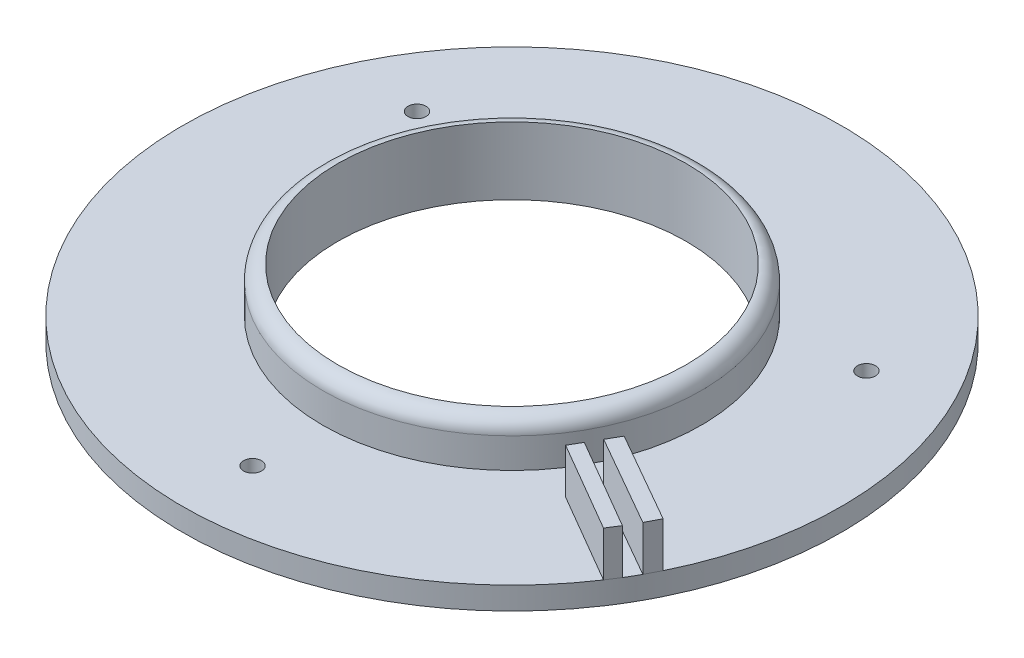
ISO-10303-21;
HEADER;
FILE_DESCRIPTION(('STEP AP214'),'2;1');
FILE_NAME('part.step','',(''),(''),'','','');
FILE_SCHEMA(('AUTOMOTIVE_DESIGN { 1 0 10303 214 1 1 1 1 }'));
ENDSEC;
DATA;
#1=APPLICATION_CONTEXT('core data for automotive mechanical design processes');
#2=APPLICATION_PROTOCOL_DEFINITION('international standard','automotive_design',2000,#1);
#3=PRODUCT_CONTEXT('',#1,'mechanical');
#4=PRODUCT('Part','Part','',(#3));
#5=PRODUCT_RELATED_PRODUCT_CATEGORY('part','',(#4));
#6=PRODUCT_DEFINITION_FORMATION('','',#4);
#7=PRODUCT_DEFINITION_CONTEXT('part definition',#1,'design');
#8=PRODUCT_DEFINITION('design','',#6,#7);
#9=PRODUCT_DEFINITION_SHAPE('','',#8);
#10=(LENGTH_UNIT() NAMED_UNIT(*) SI_UNIT(.MILLI.,.METRE.));
#11=(NAMED_UNIT(*) PLANE_ANGLE_UNIT() SI_UNIT($,.RADIAN.));
#12=(NAMED_UNIT(*) SI_UNIT($,.STERADIAN.) SOLID_ANGLE_UNIT());
#13=UNCERTAINTY_MEASURE_WITH_UNIT(LENGTH_MEASURE(1.E-05),#10,'distance_accuracy_value','');
#14=(GEOMETRIC_REPRESENTATION_CONTEXT(3) GLOBAL_UNCERTAINTY_ASSIGNED_CONTEXT((#13)) GLOBAL_UNIT_ASSIGNED_CONTEXT((#10,
#11,#12)) REPRESENTATION_CONTEXT('',''));
#15=CARTESIAN_POINT('',(0.,0.,0.));
#16=DIRECTION('',(0.,0.,1.));
#17=DIRECTION('',(1.,0.,0.));
#18=AXIS2_PLACEMENT_3D('',#15,#16,#17);
#19=CARTESIAN_POINT('',(0.,-23.5,0.));
#20=DIRECTION('',(0.,1.,0.));
#21=DIRECTION('',(0.,0.,1.));
#22=AXIS2_PLACEMENT_3D('',#19,#20,#21);
#23=PLANE('',#22);
#24=CARTESIAN_POINT('',(0.,-23.5,17.315));
#25=DIRECTION('',(0.,-1.,0.));
#26=DIRECTION('',(0.,0.,-1.));
#27=AXIS2_PLACEMENT_3D('',#24,#25,#26);
#28=CIRCLE('',#27,0.6);
#29=CARTESIAN_POINT('',(0.,-23.5,16.715));
#30=VERTEX_POINT('',#29);
#31=EDGE_CURVE('E240',#30,#30,#28,.T.);
#32=ORIENTED_EDGE('',*,*,#31,.T.);
#33=EDGE_LOOP('',(#32));
#34=FACE_BOUND('',#33,.T.);
#35=CARTESIAN_POINT('',(14.9952298665276,-23.5,-8.65750000000009));
#36=DIRECTION('',(0.,-1.,0.));
#37=DIRECTION('',(-0.866025403784436,0.,0.500000000000004));
#38=AXIS2_PLACEMENT_3D('',#35,#36,#37);
#39=CIRCLE('',#38,0.6);
#40=CARTESIAN_POINT('',(14.4756146242569,-23.5,-8.35750000000009));
#41=VERTEX_POINT('',#40);
#42=EDGE_CURVE('E234',#41,#41,#39,.T.);
#43=ORIENTED_EDGE('',*,*,#42,.T.);
#44=EDGE_LOOP('',(#43));
#45=FACE_BOUND('',#44,.T.);
#46=CARTESIAN_POINT('',(-14.9952298665277,-23.5,-8.65749999999989));
#47=DIRECTION('',(0.,-1.,0.));
#48=DIRECTION('',(0.866025403784443,0.,0.499999999999992));
#49=AXIS2_PLACEMENT_3D('',#46,#47,#48);
#50=CIRCLE('',#49,0.6);
#51=CARTESIAN_POINT('',(-14.475614624257,-23.5,-8.35749999999989));
#52=VERTEX_POINT('',#51);
#53=EDGE_CURVE('E225',#52,#52,#50,.T.);
#54=ORIENTED_EDGE('',*,*,#53,.T.);
#55=EDGE_LOOP('',(#54));
#56=FACE_BOUND('',#55,.T.);
#57=DIRECTION('',(-0.864216917578454,0.,-0.503119388784805));
#58=VECTOR('',#57,1.);
#59=CARTESIAN_POINT('',(-0.211658076801947,-23.5,0.363568756823643));
#60=LINE('',#59,#58);
#61=CARTESIAN_POINT('',(18.7976376488004,-23.5,11.4301714258537));
#62=VERTEX_POINT('',#61);
#63=CARTESIAN_POINT('',(12.7166216174599,-23.5,7.88999880640151));
#64=VERTEX_POINT('',#63);
#65=EDGE_CURVE('E157',#62,#64,#60,.T.);
#66=ORIENTED_EDGE('',*,*,#65,.F.);
#67=CARTESIAN_POINT('',(0.,-23.5,0.));
#68=DIRECTION('',(0.,1.,0.));
#69=DIRECTION('',(0.,0.,1.));
#70=AXIS2_PLACEMENT_3D('',#67,#68,#69);
#71=CIRCLE('',#70,22.);
#72=CARTESIAN_POINT('',(19.2976376488004,-23.5,10.5641460220692));
#73=VERTEX_POINT('',#72);
#74=EDGE_CURVE('E256',#62,#73,#71,.T.);
#75=ORIENTED_EDGE('',*,*,#74,.T.);
#76=DIRECTION('',(0.867839451852913,0.,0.496844730079364));
#77=VECTOR('',#76,1.);
#78=CARTESIAN_POINT('',(0.208648392105281,-23.5,-0.364446466415604));
#79=LINE('',#78,#77);
#80=CARTESIAN_POINT('',(13.1864182611817,-23.5,7.06542613717075));
#81=VERTEX_POINT('',#80);
#82=EDGE_CURVE('E201',#81,#73,#79,.T.);
#83=ORIENTED_EDGE('',*,*,#82,.F.);
#84=DIRECTION('',(-0.496844730079368,0.,0.867839451852911));
#85=VECTOR('',#84,1.);
#86=CARTESIAN_POINT('',(12.9777698690763,-23.5,7.42987260358641));
#87=LINE('',#86,#85);
#88=CARTESIAN_POINT('',(13.6833751023745,-23.5,6.19739086066407));
#89=VERTEX_POINT('',#88);
#90=EDGE_CURVE('E210',#89,#81,#87,.T.);
#91=ORIENTED_EDGE('',*,*,#90,.F.);
#92=DIRECTION('',(-0.867839451852913,0.,-0.496844730079364));
#93=VECTOR('',#92,1.);
#94=CARTESIAN_POINT('',(0.705605233298096,-23.5,-1.23248174292229));
#95=LINE('',#94,#93);
#96=CARTESIAN_POINT('',(19.7582512653449,-23.5,9.67530397121961));
#97=VERTEX_POINT('',#96);
#98=EDGE_CURVE('E309',#97,#89,#95,.T.);
#99=ORIENTED_EDGE('',*,*,#98,.F.);
#100=CARTESIAN_POINT('',(18.3067413183526,-23.5,12.2009516966064));
#101=VERTEX_POINT('',#100);
#102=EDGE_CURVE('E252',#97,#101,#71,.T.);
#103=ORIENTED_EDGE('',*,*,#102,.T.);
#104=DIRECTION('',(0.864216917578454,0.,0.503119388784805));
#105=VECTOR('',#104,1.);
#106=CARTESIAN_POINT('',(-0.671056798958525,-23.5,1.15268592553497));
#107=LINE('',#106,#105);
#108=CARTESIAN_POINT('',(12.2572228953033,-23.5,8.67911597511284));
#109=VERTEX_POINT('',#108);
#110=EDGE_CURVE('E53',#109,#101,#107,.T.);
#111=ORIENTED_EDGE('',*,*,#110,.F.);
#112=DIRECTION('',(-0.503119388784806,0.,0.864216917578453));
#113=VECTOR('',#112,1.);
#114=CARTESIAN_POINT('',(12.9282796942619,-23.5,7.52643004957789));
#115=LINE('',#114,#113);
#116=EDGE_CURVE('E48',#64,#109,#115,.T.);
#117=ORIENTED_EDGE('',*,*,#116,.F.);
#118=EDGE_LOOP('',(#66,#75,#83,#91,#99,#103,#111,#117));
#119=FACE_BOUND('',#118,.T.);
#120=CARTESIAN_POINT('',(0.,-23.5,0.));
#121=DIRECTION('',(0.,1.,0.));
#122=DIRECTION('',(0.,0.,1.));
#123=AXIS2_PLACEMENT_3D('',#120,#121,#122);
#124=CIRCLE('',#123,12.63);
#125=CARTESIAN_POINT('',(0.,-23.5,12.63));
#126=VERTEX_POINT('',#125);
#127=EDGE_CURVE('E139',#126,#126,#124,.T.);
#128=ORIENTED_EDGE('',*,*,#127,.F.);
#129=EDGE_LOOP('',(#128));
#130=FACE_BOUND('',#129,.T.);
#131=ADVANCED_FACE('F33',(#34,#45,#56,#119,#130),#23,.T.);
#132=CARTESIAN_POINT('',(0.,-25.,0.));
#133=DIRECTION('',(0.,1.,0.));
#134=DIRECTION('',(0.,0.,1.));
#135=AXIS2_PLACEMENT_3D('',#132,#133,#134);
#136=PLANE('',#135);
#137=CARTESIAN_POINT('',(-14.9952298665277,-25.,-8.65749999999989));
#138=DIRECTION('',(0.,-1.,0.));
#139=DIRECTION('',(0.866025403784443,0.,0.499999999999992));
#140=AXIS2_PLACEMENT_3D('',#137,#138,#139);
#141=CIRCLE('',#140,0.6);
#142=CARTESIAN_POINT('',(-14.475614624257,-25.,-8.35749999999989));
#143=VERTEX_POINT('',#142);
#144=EDGE_CURVE('E220',#143,#143,#141,.T.);
#145=ORIENTED_EDGE('',*,*,#144,.F.);
#146=EDGE_LOOP('',(#145));
#147=FACE_BOUND('',#146,.T.);
#148=CARTESIAN_POINT('',(14.9952298665276,-25.,-8.65750000000009));
#149=DIRECTION('',(0.,-1.,0.));
#150=DIRECTION('',(-0.866025403784436,0.,0.500000000000004));
#151=AXIS2_PLACEMENT_3D('',#148,#149,#150);
#152=CIRCLE('',#151,0.6);
#153=CARTESIAN_POINT('',(14.4756146242569,-25.,-8.35750000000009));
#154=VERTEX_POINT('',#153);
#155=EDGE_CURVE('E230',#154,#154,#152,.T.);
#156=ORIENTED_EDGE('',*,*,#155,.F.);
#157=EDGE_LOOP('',(#156));
#158=FACE_BOUND('',#157,.T.);
#159=CARTESIAN_POINT('',(0.,-25.,17.315));
#160=DIRECTION('',(0.,-1.,0.));
#161=DIRECTION('',(0.,0.,-1.));
#162=AXIS2_PLACEMENT_3D('',#159,#160,#161);
#163=CIRCLE('',#162,0.6);
#164=CARTESIAN_POINT('',(0.,-25.,16.715));
#165=VERTEX_POINT('',#164);
#166=EDGE_CURVE('E237',#165,#165,#163,.T.);
#167=ORIENTED_EDGE('',*,*,#166,.F.);
#168=EDGE_LOOP('',(#167));
#169=FACE_BOUND('',#168,.T.);
#170=CARTESIAN_POINT('',(0.,-25.,0.));
#171=DIRECTION('',(0.,1.,0.));
#172=DIRECTION('',(0.,0.,1.));
#173=AXIS2_PLACEMENT_3D('',#170,#171,#172);
#174=CIRCLE('',#173,22.);
#175=CARTESIAN_POINT('',(18.7976376488004,-25.,11.4301714258537));
#176=VERTEX_POINT('',#175);
#177=CARTESIAN_POINT('',(19.2976376488004,-25.,10.5641460220693));
#178=VERTEX_POINT('',#177);
#179=EDGE_CURVE('E243',#176,#178,#174,.T.);
#180=ORIENTED_EDGE('',*,*,#179,.F.);
#181=CARTESIAN_POINT('',(0.,-25.,0.));
#182=DIRECTION('',(0.,1.,0.));
#183=DIRECTION('',(0.83212460537966,0.,0.554588713482112));
#184=AXIS2_PLACEMENT_3D('',#181,#182,#183);
#185=CIRCLE('',#184,22.);
#186=CARTESIAN_POINT('',(18.3067413183525,-25.,12.2009516966065));
#187=VERTEX_POINT('',#186);
#188=EDGE_CURVE('E41',#187,#176,#185,.T.);
#189=ORIENTED_EDGE('',*,*,#188,.F.);
#190=CARTESIAN_POINT('',(19.7582512653448,-25.,9.67530397121965));
#191=VERTEX_POINT('',#190);
#192=EDGE_CURVE('E259',#191,#187,#174,.T.);
#193=ORIENTED_EDGE('',*,*,#192,.F.);
#194=CARTESIAN_POINT('',(0.,-25.,0.));
#195=DIRECTION('',(0.,1.,0.));
#196=DIRECTION('',(0.877165347672745,0.,0.480188455548602));
#197=AXIS2_PLACEMENT_3D('',#194,#195,#196);
#198=CIRCLE('',#197,22.);
#199=EDGE_CURVE('E297',#178,#191,#198,.T.);
#200=ORIENTED_EDGE('',*,*,#199,.F.);
#201=EDGE_LOOP('',(#180,#189,#193,#200));
#202=FACE_BOUND('',#201,.T.);
#203=CARTESIAN_POINT('',(0.,-25.,0.));
#204=DIRECTION('',(0.,1.,0.));
#205=DIRECTION('',(0.,0.,1.));
#206=AXIS2_PLACEMENT_3D('',#203,#204,#205);
#207=CIRCLE('',#206,11.63);
#208=CARTESIAN_POINT('',(0.,-25.,11.63));
#209=VERTEX_POINT('',#208);
#210=EDGE_CURVE('E136',#209,#209,#207,.T.);
#211=ORIENTED_EDGE('',*,*,#210,.T.);
#212=EDGE_LOOP('',(#211));
#213=FACE_BOUND('',#212,.T.);
#214=ADVANCED_FACE('F270',(#147,#158,#169,#202,#213),#136,.F.);
#215=CARTESIAN_POINT('',(0.,-23.5,0.));
#216=DIRECTION('',(0.,-1.,0.));
#217=DIRECTION('',(0.,0.,-1.));
#218=AXIS2_PLACEMENT_3D('',#215,#216,#217);
#219=CYLINDRICAL_SURFACE('',#218,22.);
#220=ORIENTED_EDGE('',*,*,#192,.T.);
#221=ORIENTED_EDGE('',*,*,#188,.T.);
#222=ORIENTED_EDGE('',*,*,#179,.T.);
#223=ORIENTED_EDGE('',*,*,#199,.T.);
#224=EDGE_LOOP('',(#220,#221,#222,#223));
#225=FACE_BOUND('',#224,.T.);
#226=CARTESIAN_POINT('',(18.3067413183525,-23.5,12.2009516966065));
#227=DIRECTION('',(0.537186848637628,0.,-0.843463271073954));
#228=VECTOR('',#227,1.);
#229=LINE('',#226,#228);
#230=EDGE_CURVE('E116',#101,#62,#229,.T.);
#231=ORIENTED_EDGE('',*,*,#230,.F.);
#232=ORIENTED_EDGE('',*,*,#102,.F.);
#233=CARTESIAN_POINT('',(19.2976376488004,-23.5,10.5641460220693));
#234=DIRECTION('',(0.460106606479104,0.,-0.887863677978936));
#235=VECTOR('',#234,1.);
#236=LINE('',#233,#235);
#237=EDGE_CURVE('E211',#73,#97,#236,.T.);
#238=ORIENTED_EDGE('',*,*,#237,.F.);
#239=ORIENTED_EDGE('',*,*,#74,.F.);
#240=EDGE_LOOP('',(#231,#232,#238,#239));
#241=FACE_BOUND('',#240,.T.);
#242=ADVANCED_FACE('F279',(#225,#241),#219,.T.);
#243=CARTESIAN_POINT('',(0.,-23.5,17.315));
#244=DIRECTION('',(0.,-1.,0.));
#245=DIRECTION('',(0.,0.,-1.));
#246=AXIS2_PLACEMENT_3D('',#243,#244,#245);
#247=CYLINDRICAL_SURFACE('',#246,0.6);
#248=ORIENTED_EDGE('',*,*,#31,.F.);
#249=EDGE_LOOP('',(#248));
#250=FACE_BOUND('',#249,.T.);
#251=ORIENTED_EDGE('',*,*,#166,.T.);
#252=EDGE_LOOP('',(#251));
#253=FACE_BOUND('',#252,.T.);
#254=ADVANCED_FACE('F338',(#250,#253),#247,.F.);
#255=CARTESIAN_POINT('',(14.9952298665276,-23.5,-8.65750000000009));
#256=DIRECTION('',(0.,-1.,0.));
#257=DIRECTION('',(0.,0.,-1.));
#258=AXIS2_PLACEMENT_3D('',#255,#256,#257);
#259=CYLINDRICAL_SURFACE('',#258,0.6);
#260=ORIENTED_EDGE('',*,*,#42,.F.);
#261=EDGE_LOOP('',(#260));
#262=FACE_BOUND('',#261,.T.);
#263=ORIENTED_EDGE('',*,*,#155,.T.);
#264=EDGE_LOOP('',(#263));
#265=FACE_BOUND('',#264,.T.);
#266=ADVANCED_FACE('F330',(#262,#265),#259,.F.);
#267=CARTESIAN_POINT('',(-14.9952298665277,-23.5,-8.65749999999989));
#268=DIRECTION('',(0.,-1.,0.));
#269=DIRECTION('',(0.,0.,-1.));
#270=AXIS2_PLACEMENT_3D('',#267,#268,#269);
#271=CYLINDRICAL_SURFACE('',#270,0.6);
#272=ORIENTED_EDGE('',*,*,#53,.F.);
#273=EDGE_LOOP('',(#272));
#274=FACE_BOUND('',#273,.T.);
#275=ORIENTED_EDGE('',*,*,#144,.T.);
#276=EDGE_LOOP('',(#275));
#277=FACE_BOUND('',#276,.T.);
#278=ADVANCED_FACE('F328',(#274,#277),#271,.F.);
#279=CARTESIAN_POINT('',(13.1864182611817,-20.5,7.06542613717075));
#280=DIRECTION('',(-0.496844730079364,0.,0.867839451852913));
#281=DIRECTION('',(0.867839451852913,0.,0.496844730079364));
#282=AXIS2_PLACEMENT_3D('',#279,#280,#281);
#283=PLANE('',#282);
#284=DIRECTION('',(0.,-1.,0.));
#285=VECTOR('',#284,1.);
#286=CARTESIAN_POINT('',(13.1864182611817,-20.5,7.06542613717075));
#287=LINE('',#286,#285);
#288=CARTESIAN_POINT('',(13.1864182611817,-20.5,7.06542613717075));
#289=VERTEX_POINT('',#288);
#290=EDGE_CURVE('E497',#289,#81,#287,.T.);
#291=ORIENTED_EDGE('',*,*,#290,.T.);
#292=ORIENTED_EDGE('',*,*,#82,.T.);
#293=DIRECTION('',(0.,-1.,0.));
#294=VECTOR('',#293,1.);
#295=CARTESIAN_POINT('',(19.2976376488004,-20.5,10.5641460220693));
#296=LINE('',#295,#294);
#297=CARTESIAN_POINT('',(19.2976376488004,-20.5,10.5641460220693));
#298=VERTEX_POINT('',#297);
#299=EDGE_CURVE('E212',#298,#73,#296,.T.);
#300=ORIENTED_EDGE('',*,*,#299,.F.);
#301=DIRECTION('',(-0.867839451852913,0.,-0.496844730079364));
#302=VECTOR('',#301,1.);
#303=CARTESIAN_POINT('',(13.1864182611817,-20.5,7.06542613717075));
#304=LINE('',#303,#302);
#305=EDGE_CURVE('E163',#298,#289,#304,.T.);
#306=ORIENTED_EDGE('',*,*,#305,.T.);
#307=EDGE_LOOP('',(#291,#292,#300,#306));
#308=FACE_BOUND('',#307,.T.);
#309=ADVANCED_FACE('F191',(#308),#283,.T.);
#310=CARTESIAN_POINT('',(19.7582512653449,-20.5,9.67530397121961));
#311=DIRECTION('',(0.887863677978936,0.,0.460106606479104));
#312=DIRECTION('',(0.460106606479104,0.,-0.887863677978936));
#313=AXIS2_PLACEMENT_3D('',#310,#311,#312);
#314=PLANE('',#313);
#315=ORIENTED_EDGE('',*,*,#299,.T.);
#316=ORIENTED_EDGE('',*,*,#237,.T.);
#317=DIRECTION('',(0.,-1.,0.));
#318=VECTOR('',#317,1.);
#319=CARTESIAN_POINT('',(19.7582512653449,-20.5,9.67530397121961));
#320=LINE('',#319,#318);
#321=CARTESIAN_POINT('',(19.7582512653449,-20.5,9.67530397121961));
#322=VERTEX_POINT('',#321);
#323=EDGE_CURVE('E490',#322,#97,#320,.T.);
#324=ORIENTED_EDGE('',*,*,#323,.F.);
#325=DIRECTION('',(-0.460106606479104,0.,0.887863677978936));
#326=VECTOR('',#325,1.);
#327=CARTESIAN_POINT('',(19.7582512653449,-20.5,9.67530397121961));
#328=LINE('',#327,#326);
#329=EDGE_CURVE('E503',#322,#298,#328,.T.);
#330=ORIENTED_EDGE('',*,*,#329,.T.);
#331=EDGE_LOOP('',(#315,#316,#324,#330));
#332=FACE_BOUND('',#331,.T.);
#333=ADVANCED_FACE('F186',(#332),#314,.T.);
#334=CARTESIAN_POINT('',(13.6833751023745,-20.5,6.19739086066407));
#335=DIRECTION('',(0.496844730079364,0.,-0.867839451852913));
#336=DIRECTION('',(-0.867839451852913,0.,-0.496844730079364));
#337=AXIS2_PLACEMENT_3D('',#334,#335,#336);
#338=PLANE('',#337);
#339=ORIENTED_EDGE('',*,*,#323,.T.);
#340=ORIENTED_EDGE('',*,*,#98,.T.);
#341=DIRECTION('',(0.,-1.,0.));
#342=VECTOR('',#341,1.);
#343=CARTESIAN_POINT('',(13.6833751023745,-20.5,6.19739086066407));
#344=LINE('',#343,#342);
#345=CARTESIAN_POINT('',(13.6833751023745,-20.5,6.19739086066407));
#346=VERTEX_POINT('',#345);
#347=EDGE_CURVE('E495',#346,#89,#344,.T.);
#348=ORIENTED_EDGE('',*,*,#347,.F.);
#349=DIRECTION('',(0.867839451852913,0.,0.496844730079364));
#350=VECTOR('',#349,1.);
#351=CARTESIAN_POINT('',(13.6833751023745,-20.5,6.19739086066407));
#352=LINE('',#351,#350);
#353=EDGE_CURVE('E492',#346,#322,#352,.T.);
#354=ORIENTED_EDGE('',*,*,#353,.T.);
#355=EDGE_LOOP('',(#339,#340,#348,#354));
#356=FACE_BOUND('',#355,.T.);
#357=ADVANCED_FACE('F190',(#356),#338,.T.);
#358=CARTESIAN_POINT('',(13.1864182611817,-20.5,7.06542613717075));
#359=DIRECTION('',(-0.867839451852911,0.,-0.496844730079367));
#360=DIRECTION('',(-0.496844730079368,0.,0.867839451852911));
#361=AXIS2_PLACEMENT_3D('',#358,#359,#360);
#362=PLANE('',#361);
#363=ORIENTED_EDGE('',*,*,#347,.T.);
#364=ORIENTED_EDGE('',*,*,#90,.T.);
#365=ORIENTED_EDGE('',*,*,#290,.F.);
#366=DIRECTION('',(0.496844730079367,0.,-0.867839451852911));
#367=VECTOR('',#366,1.);
#368=CARTESIAN_POINT('',(13.1864182611817,-20.5,7.06542613717075));
#369=LINE('',#368,#367);
#370=EDGE_CURVE('E505',#289,#346,#369,.T.);
#371=ORIENTED_EDGE('',*,*,#370,.T.);
#372=EDGE_LOOP('',(#363,#364,#365,#371));
#373=FACE_BOUND('',#372,.T.);
#374=ADVANCED_FACE('F184',(#373),#362,.T.);
#375=CARTESIAN_POINT('',(0.,-20.5,0.));
#376=DIRECTION('',(0.,1.,0.));
#377=DIRECTION('',(0.,0.,1.));
#378=AXIS2_PLACEMENT_3D('',#375,#376,#377);
#379=PLANE('',#378);
#380=ORIENTED_EDGE('',*,*,#305,.F.);
#381=ORIENTED_EDGE('',*,*,#329,.F.);
#382=ORIENTED_EDGE('',*,*,#353,.F.);
#383=ORIENTED_EDGE('',*,*,#370,.F.);
#384=EDGE_LOOP('',(#380,#381,#382,#383));
#385=FACE_BOUND('',#384,.T.);
#386=ADVANCED_FACE('F181',(#385),#379,.T.);
#387=CARTESIAN_POINT('',(18.7976376488004,-20.5,11.4301714258537));
#388=DIRECTION('',(0.503119388784805,0.,-0.864216917578454));
#389=DIRECTION('',(-0.864216917578454,0.,-0.503119388784805));
#390=AXIS2_PLACEMENT_3D('',#387,#388,#389);
#391=PLANE('',#390);
#392=DIRECTION('',(0.,-1.,0.));
#393=VECTOR('',#392,1.);
#394=CARTESIAN_POINT('',(18.7976376488004,-20.5,11.4301714258537));
#395=LINE('',#394,#393);
#396=CARTESIAN_POINT('',(18.7976376488004,-20.5,11.4301714258537));
#397=VERTEX_POINT('',#396);
#398=EDGE_CURVE('E111',#397,#62,#395,.T.);
#399=ORIENTED_EDGE('',*,*,#398,.T.);
#400=ORIENTED_EDGE('',*,*,#65,.T.);
#401=DIRECTION('',(0.,-1.,0.));
#402=VECTOR('',#401,1.);
#403=CARTESIAN_POINT('',(12.7166216174599,-20.5,7.88999880640151));
#404=LINE('',#403,#402);
#405=CARTESIAN_POINT('',(12.7166216174599,-20.5,7.88999880640151));
#406=VERTEX_POINT('',#405);
#407=EDGE_CURVE('E135',#406,#64,#404,.T.);
#408=ORIENTED_EDGE('',*,*,#407,.F.);
#409=DIRECTION('',(0.864216917578454,0.,0.503119388784805));
#410=VECTOR('',#409,1.);
#411=CARTESIAN_POINT('',(18.7976376488004,-20.5,11.4301714258537));
#412=LINE('',#411,#410);
#413=EDGE_CURVE('E128',#406,#397,#412,.T.);
#414=ORIENTED_EDGE('',*,*,#413,.T.);
#415=EDGE_LOOP('',(#399,#400,#408,#414));
#416=FACE_BOUND('',#415,.T.);
#417=ADVANCED_FACE('F133',(#416),#391,.T.);
#418=CARTESIAN_POINT('',(12.7166216174599,-20.5,7.88999880640151));
#419=DIRECTION('',(-0.864216917578453,0.,-0.503119388784806));
#420=DIRECTION('',(-0.503119388784806,0.,0.864216917578453));
#421=AXIS2_PLACEMENT_3D('',#418,#419,#420);
#422=PLANE('',#421);
#423=ORIENTED_EDGE('',*,*,#407,.T.);
#424=ORIENTED_EDGE('',*,*,#116,.T.);
#425=DIRECTION('',(0.,-1.,0.));
#426=VECTOR('',#425,1.);
#427=CARTESIAN_POINT('',(12.2572228953033,-20.5,8.67911597511284));
#428=LINE('',#427,#426);
#429=CARTESIAN_POINT('',(12.2572228953033,-20.5,8.67911597511284));
#430=VERTEX_POINT('',#429);
#431=EDGE_CURVE('E146',#430,#109,#428,.T.);
#432=ORIENTED_EDGE('',*,*,#431,.F.);
#433=DIRECTION('',(0.503119388784806,0.,-0.864216917578453));
#434=VECTOR('',#433,1.);
#435=CARTESIAN_POINT('',(12.7166216174599,-20.5,7.88999880640151));
#436=LINE('',#435,#434);
#437=EDGE_CURVE('E121',#430,#406,#436,.T.);
#438=ORIENTED_EDGE('',*,*,#437,.T.);
#439=EDGE_LOOP('',(#423,#424,#432,#438));
#440=FACE_BOUND('',#439,.T.);
#441=ADVANCED_FACE('F180',(#440),#422,.T.);
#442=CARTESIAN_POINT('',(12.2572228953033,-20.5,8.67911597511284));
#443=DIRECTION('',(-0.503119388784805,0.,0.864216917578454));
#444=DIRECTION('',(0.864216917578454,0.,0.503119388784805));
#445=AXIS2_PLACEMENT_3D('',#442,#443,#444);
#446=PLANE('',#445);
#447=ORIENTED_EDGE('',*,*,#431,.T.);
#448=ORIENTED_EDGE('',*,*,#110,.T.);
#449=DIRECTION('',(0.,-1.,0.));
#450=VECTOR('',#449,1.);
#451=CARTESIAN_POINT('',(18.3067413183525,-20.5,12.2009516966065));
#452=LINE('',#451,#450);
#453=CARTESIAN_POINT('',(18.3067413183525,-20.5,12.2009516966065));
#454=VERTEX_POINT('',#453);
#455=EDGE_CURVE('E120',#454,#101,#452,.T.);
#456=ORIENTED_EDGE('',*,*,#455,.F.);
#457=DIRECTION('',(-0.864216917578454,0.,-0.503119388784805));
#458=VECTOR('',#457,1.);
#459=CARTESIAN_POINT('',(12.2572228953033,-20.5,8.67911597511284));
#460=LINE('',#459,#458);
#461=EDGE_CURVE('E131',#454,#430,#460,.T.);
#462=ORIENTED_EDGE('',*,*,#461,.T.);
#463=EDGE_LOOP('',(#447,#448,#456,#462));
#464=FACE_BOUND('',#463,.T.);
#465=ADVANCED_FACE('F176',(#464),#446,.T.);
#466=CARTESIAN_POINT('',(18.3067413183525,-20.5,12.2009516966065));
#467=DIRECTION('',(0.843463271073954,0.,0.537186848637628));
#468=DIRECTION('',(0.537186848637628,0.,-0.843463271073954));
#469=AXIS2_PLACEMENT_3D('',#466,#467,#468);
#470=PLANE('',#469);
#471=ORIENTED_EDGE('',*,*,#455,.T.);
#472=ORIENTED_EDGE('',*,*,#230,.T.);
#473=ORIENTED_EDGE('',*,*,#398,.F.);
#474=DIRECTION('',(-0.537186848637628,0.,0.843463271073954));
#475=VECTOR('',#474,1.);
#476=CARTESIAN_POINT('',(18.3067413183525,-20.5,12.2009516966065));
#477=LINE('',#476,#475);
#478=EDGE_CURVE('E115',#397,#454,#477,.T.);
#479=ORIENTED_EDGE('',*,*,#478,.T.);
#480=EDGE_LOOP('',(#471,#472,#473,#479));
#481=FACE_BOUND('',#480,.T.);
#482=ADVANCED_FACE('F114',(#481),#470,.T.);
#483=CARTESIAN_POINT('',(0.,-20.5,0.));
#484=DIRECTION('',(0.,1.,0.));
#485=DIRECTION('',(0.,0.,1.));
#486=AXIS2_PLACEMENT_3D('',#483,#484,#485);
#487=PLANE('',#486);
#488=ORIENTED_EDGE('',*,*,#413,.F.);
#489=ORIENTED_EDGE('',*,*,#437,.F.);
#490=ORIENTED_EDGE('',*,*,#461,.F.);
#491=ORIENTED_EDGE('',*,*,#478,.F.);
#492=EDGE_LOOP('',(#488,#489,#490,#491));
#493=FACE_BOUND('',#492,.T.);
#494=ADVANCED_FACE('F126',(#493),#487,.T.);
#495=CARTESIAN_POINT('',(0.,-25.,0.));
#496=DIRECTION('',(0.,1.,0.));
#497=DIRECTION('',(0.,0.,1.));
#498=AXIS2_PLACEMENT_3D('',#495,#496,#497);
#499=CYLINDRICAL_SURFACE('',#498,11.63);
#500=ORIENTED_EDGE('',*,*,#210,.F.);
#501=EDGE_LOOP('',(#500));
#502=FACE_BOUND('',#501,.T.);
#503=CARTESIAN_POINT('',(0.,-20.5,0.));
#504=DIRECTION('',(0.,1.,0.));
#505=DIRECTION('',(0.,0.,1.));
#506=AXIS2_PLACEMENT_3D('',#503,#504,#505);
#507=CIRCLE('',#506,11.63);
#508=CARTESIAN_POINT('',(0.,-20.5,11.63));
#509=VERTEX_POINT('',#508);
#510=EDGE_CURVE('E359',#509,#509,#507,.T.);
#511=ORIENTED_EDGE('',*,*,#510,.T.);
#512=EDGE_LOOP('',(#511));
#513=FACE_BOUND('',#512,.T.);
#514=ADVANCED_FACE('F352',(#502,#513),#499,.F.);
#515=CARTESIAN_POINT('',(0.,-20.5,0.));
#516=DIRECTION('',(0.,-1.,0.));
#517=DIRECTION('',(0.,0.,-1.));
#518=AXIS2_PLACEMENT_3D('',#515,#516,#517);
#519=CYLINDRICAL_SURFACE('',#518,12.63);
#520=CARTESIAN_POINT('',(0.,-21.5,0.));
#521=DIRECTION('',(0.,1.,0.));
#522=DIRECTION('',(0.,0.,1.));
#523=AXIS2_PLACEMENT_3D('',#520,#521,#522);
#524=CIRCLE('',#523,12.63);
#525=CARTESIAN_POINT('',(0.,-21.5,12.63));
#526=VERTEX_POINT('',#525);
#527=EDGE_CURVE('E11',#526,#526,#524,.F.);
#528=ORIENTED_EDGE('',*,*,#527,.T.);
#529=EDGE_LOOP('',(#528));
#530=FACE_BOUND('',#529,.T.);
#531=ORIENTED_EDGE('',*,*,#127,.T.);
#532=EDGE_LOOP('',(#531));
#533=FACE_BOUND('',#532,.T.);
#534=ADVANCED_FACE('F355',(#530,#533),#519,.T.);
#535=CARTESIAN_POINT('',(0.,-21.5,0.));
#536=DIRECTION('',(0.,1.,0.));
#537=DIRECTION('',(0.,0.,1.));
#538=AXIS2_PLACEMENT_3D('',#535,#536,#537);
#539=TOROIDAL_SURFACE('',#538,11.63,1.);
#540=ORIENTED_EDGE('',*,*,#527,.F.);
#541=EDGE_LOOP('',(#540));
#542=FACE_BOUND('',#541,.T.);
#543=ORIENTED_EDGE('',*,*,#510,.F.);
#544=EDGE_LOOP('',(#543));
#545=FACE_BOUND('',#544,.T.);
#546=ADVANCED_FACE('F35',(#542,#545),#539,.T.);
#547=CLOSED_SHELL('',(#131,#214,#242,#254,#266,#278,#309,#333,#357,#374,#386,#417,#441,#465,
#482,#494,#514,#534,#546));
#548=MANIFOLD_SOLID_BREP('B2',#547);
#549=ADVANCED_BREP_SHAPE_REPRESENTATION('',(#18,#548),#14);
#550=SHAPE_DEFINITION_REPRESENTATION(#9,#549);
ENDSEC;
END-ISO-10303-21;
